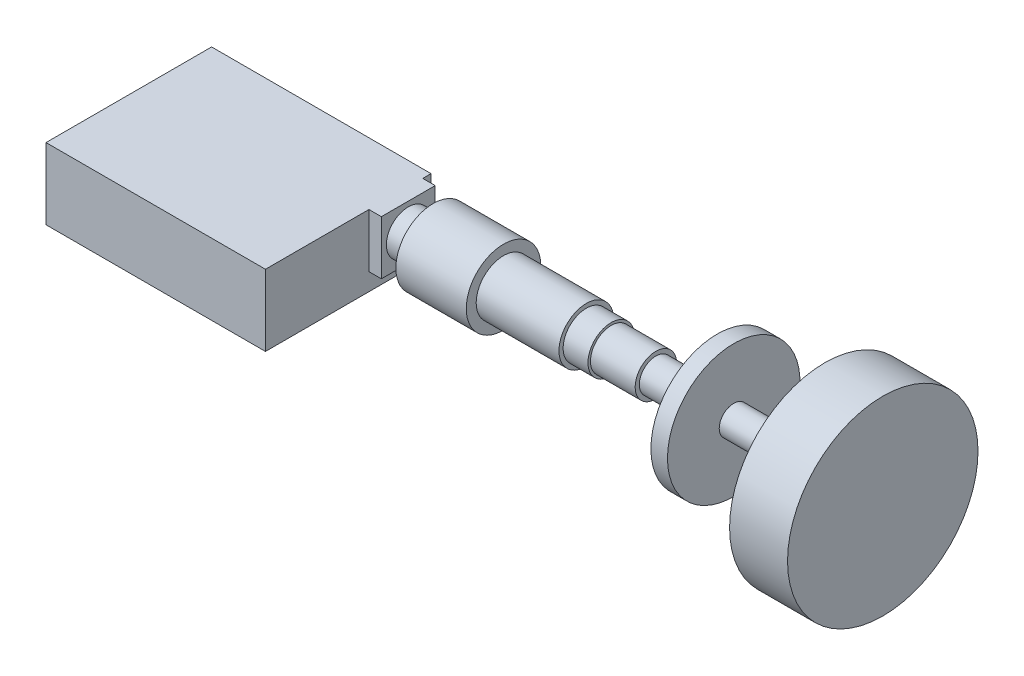
ISO-10303-21;
HEADER;
FILE_DESCRIPTION(('STEP AP214'),'2;1');
FILE_NAME('part.step','',(''),(''),'','','');
FILE_SCHEMA(('AUTOMOTIVE_DESIGN { 1 0 10303 214 1 1 1 1 }'));
ENDSEC;
DATA;
#1=APPLICATION_CONTEXT('core data for automotive mechanical design processes');
#2=APPLICATION_PROTOCOL_DEFINITION('international standard','automotive_design',2000,#1);
#3=PRODUCT_CONTEXT('',#1,'mechanical');
#4=PRODUCT('Part','Part','',(#3));
#5=PRODUCT_RELATED_PRODUCT_CATEGORY('part','',(#4));
#6=PRODUCT_DEFINITION_FORMATION('','',#4);
#7=PRODUCT_DEFINITION_CONTEXT('part definition',#1,'design');
#8=PRODUCT_DEFINITION('design','',#6,#7);
#9=PRODUCT_DEFINITION_SHAPE('','',#8);
#10=(LENGTH_UNIT() NAMED_UNIT(*) SI_UNIT(.MILLI.,.METRE.));
#11=(NAMED_UNIT(*) PLANE_ANGLE_UNIT() SI_UNIT($,.RADIAN.));
#12=(NAMED_UNIT(*) SI_UNIT($,.STERADIAN.) SOLID_ANGLE_UNIT());
#13=UNCERTAINTY_MEASURE_WITH_UNIT(LENGTH_MEASURE(1.E-05),#10,'distance_accuracy_value','');
#14=(GEOMETRIC_REPRESENTATION_CONTEXT(3) GLOBAL_UNCERTAINTY_ASSIGNED_CONTEXT((#13)) GLOBAL_UNIT_ASSIGNED_CONTEXT((#10,
#11,#12)) REPRESENTATION_CONTEXT('',''));
#15=CARTESIAN_POINT('',(0.,0.,0.));
#16=DIRECTION('',(0.,0.,1.));
#17=DIRECTION('',(1.,0.,0.));
#18=AXIS2_PLACEMENT_3D('',#15,#16,#17);
#19=CARTESIAN_POINT('',(13.25,8.6,10.));
#20=DIRECTION('',(-1.,0.,0.));
#21=DIRECTION('',(0.,0.,1.));
#22=AXIS2_PLACEMENT_3D('',#19,#20,#21);
#23=PLANE('',#22);
#24=DIRECTION('',(0.,-1.,0.));
#25=VECTOR('',#24,1.);
#26=CARTESIAN_POINT('',(13.25,8.6,-2.5));
#27=LINE('',#26,#25);
#28=CARTESIAN_POINT('',(13.25,8.6,-2.5));
#29=VERTEX_POINT('',#28);
#30=CARTESIAN_POINT('',(13.25,2.1,-2.50000000000001));
#31=VERTEX_POINT('',#30);
#32=EDGE_CURVE('E133',#29,#31,#27,.T.);
#33=ORIENTED_EDGE('',*,*,#32,.F.);
#34=DIRECTION('',(0.,0.,-1.));
#35=VECTOR('',#34,1.);
#36=CARTESIAN_POINT('',(13.25,8.6,10.));
#37=LINE('',#36,#35);
#38=CARTESIAN_POINT('',(13.25,8.6,10.));
#39=VERTEX_POINT('',#38);
#40=EDGE_CURVE('E146',#39,#29,#37,.T.);
#41=ORIENTED_EDGE('',*,*,#40,.F.);
#42=DIRECTION('',(0.,-1.,0.));
#43=VECTOR('',#42,1.);
#44=CARTESIAN_POINT('',(13.25,8.6,10.));
#45=LINE('',#44,#43);
#46=CARTESIAN_POINT('',(13.25,0.,10.));
#47=VERTEX_POINT('',#46);
#48=EDGE_CURVE('E158',#39,#47,#45,.T.);
#49=ORIENTED_EDGE('',*,*,#48,.T.);
#50=DIRECTION('',(0.,0.,-1.));
#51=VECTOR('',#50,1.);
#52=CARTESIAN_POINT('',(13.25,0.,10.));
#53=LINE('',#52,#51);
#54=CARTESIAN_POINT('',(13.25,0.,-10.));
#55=VERTEX_POINT('',#54);
#56=EDGE_CURVE('E135',#47,#55,#53,.T.);
#57=ORIENTED_EDGE('',*,*,#56,.T.);
#58=DIRECTION('',(0.,-1.,0.));
#59=VECTOR('',#58,1.);
#60=CARTESIAN_POINT('',(13.25,8.6,-10.));
#61=LINE('',#60,#59);
#62=CARTESIAN_POINT('',(13.25,8.6,-10.));
#63=VERTEX_POINT('',#62);
#64=EDGE_CURVE('E11',#63,#55,#61,.T.);
#65=ORIENTED_EDGE('',*,*,#64,.F.);
#66=CARTESIAN_POINT('',(13.25,8.6,-9.));
#67=VERTEX_POINT('',#66);
#68=EDGE_CURVE('E66',#67,#63,#37,.T.);
#69=ORIENTED_EDGE('',*,*,#68,.F.);
#70=DIRECTION('',(0.,1.,0.));
#71=VECTOR('',#70,1.);
#72=CARTESIAN_POINT('',(13.25,8.6,-9.));
#73=LINE('',#72,#71);
#74=CARTESIAN_POINT('',(13.25,2.1,-9.));
#75=VERTEX_POINT('',#74);
#76=EDGE_CURVE('E130',#75,#67,#73,.T.);
#77=ORIENTED_EDGE('',*,*,#76,.F.);
#78=DIRECTION('',(0.,0.,-1.));
#79=VECTOR('',#78,1.);
#80=CARTESIAN_POINT('',(13.25,2.1,-2.50000000000001));
#81=LINE('',#80,#79);
#82=EDGE_CURVE('E60',#31,#75,#81,.T.);
#83=ORIENTED_EDGE('',*,*,#82,.F.);
#84=EDGE_LOOP('',(#33,#41,#49,#57,#65,#69,#77,#83));
#85=FACE_BOUND('',#84,.T.);
#86=ADVANCED_FACE('F45',(#85),#23,.F.);
#87=CARTESIAN_POINT('',(-13.25,8.6,-10.));
#88=DIRECTION('',(0.,0.,1.));
#89=DIRECTION('',(1.,0.,0.));
#90=AXIS2_PLACEMENT_3D('',#87,#88,#89);
#91=PLANE('',#90);
#92=DIRECTION('',(-1.,0.,0.));
#93=VECTOR('',#92,1.);
#94=CARTESIAN_POINT('',(-13.25,0.,-10.));
#95=LINE('',#94,#93);
#96=CARTESIAN_POINT('',(-13.25,0.,-10.));
#97=VERTEX_POINT('',#96);
#98=EDGE_CURVE('E140',#55,#97,#95,.T.);
#99=ORIENTED_EDGE('',*,*,#98,.T.);
#100=DIRECTION('',(0.,-1.,0.));
#101=VECTOR('',#100,1.);
#102=CARTESIAN_POINT('',(-13.25,8.6,-10.));
#103=LINE('',#102,#101);
#104=CARTESIAN_POINT('',(-13.25,8.6,-10.));
#105=VERTEX_POINT('',#104);
#106=EDGE_CURVE('E53',#105,#97,#103,.T.);
#107=ORIENTED_EDGE('',*,*,#106,.F.);
#108=DIRECTION('',(-1.,0.,0.));
#109=VECTOR('',#108,1.);
#110=CARTESIAN_POINT('',(-13.25,8.6,-10.));
#111=LINE('',#110,#109);
#112=EDGE_CURVE('E150',#63,#105,#111,.T.);
#113=ORIENTED_EDGE('',*,*,#112,.F.);
#114=ORIENTED_EDGE('',*,*,#64,.T.);
#115=EDGE_LOOP('',(#99,#107,#113,#114));
#116=FACE_BOUND('',#115,.T.);
#117=ADVANCED_FACE('F296',(#116),#91,.F.);
#118=CARTESIAN_POINT('',(-13.25,8.6,10.));
#119=DIRECTION('',(1.,0.,0.));
#120=DIRECTION('',(0.,0.,-1.));
#121=AXIS2_PLACEMENT_3D('',#118,#119,#120);
#122=PLANE('',#121);
#123=DIRECTION('',(0.,0.,1.));
#124=VECTOR('',#123,1.);
#125=CARTESIAN_POINT('',(-13.25,0.,10.));
#126=LINE('',#125,#124);
#127=CARTESIAN_POINT('',(-13.25,0.,10.));
#128=VERTEX_POINT('',#127);
#129=EDGE_CURVE('E162',#97,#128,#126,.T.);
#130=ORIENTED_EDGE('',*,*,#129,.T.);
#131=DIRECTION('',(0.,-1.,0.));
#132=VECTOR('',#131,1.);
#133=CARTESIAN_POINT('',(-13.25,8.6,10.));
#134=LINE('',#133,#132);
#135=CARTESIAN_POINT('',(-13.25,8.6,10.));
#136=VERTEX_POINT('',#135);
#137=EDGE_CURVE('E171',#136,#128,#134,.T.);
#138=ORIENTED_EDGE('',*,*,#137,.F.);
#139=DIRECTION('',(0.,0.,1.));
#140=VECTOR('',#139,1.);
#141=CARTESIAN_POINT('',(-13.25,8.6,10.));
#142=LINE('',#141,#140);
#143=EDGE_CURVE('E153',#105,#136,#142,.T.);
#144=ORIENTED_EDGE('',*,*,#143,.F.);
#145=ORIENTED_EDGE('',*,*,#106,.T.);
#146=EDGE_LOOP('',(#130,#138,#144,#145));
#147=FACE_BOUND('',#146,.T.);
#148=ADVANCED_FACE('F180',(#147),#122,.F.);
#149=CARTESIAN_POINT('',(-13.25,8.6,10.));
#150=DIRECTION('',(0.,0.,-1.));
#151=DIRECTION('',(-1.,0.,0.));
#152=AXIS2_PLACEMENT_3D('',#149,#150,#151);
#153=PLANE('',#152);
#154=DIRECTION('',(1.,0.,0.));
#155=VECTOR('',#154,1.);
#156=CARTESIAN_POINT('',(-13.25,0.,10.));
#157=LINE('',#156,#155);
#158=EDGE_CURVE('E165',#128,#47,#157,.T.);
#159=ORIENTED_EDGE('',*,*,#158,.T.);
#160=ORIENTED_EDGE('',*,*,#48,.F.);
#161=DIRECTION('',(1.,0.,0.));
#162=VECTOR('',#161,1.);
#163=CARTESIAN_POINT('',(-13.25,8.6,10.));
#164=LINE('',#163,#162);
#165=EDGE_CURVE('E156',#136,#39,#164,.T.);
#166=ORIENTED_EDGE('',*,*,#165,.F.);
#167=ORIENTED_EDGE('',*,*,#137,.T.);
#168=EDGE_LOOP('',(#159,#160,#166,#167));
#169=FACE_BOUND('',#168,.T.);
#170=ADVANCED_FACE('F190',(#169),#153,.F.);
#171=CARTESIAN_POINT('',(0.,8.6,0.));
#172=DIRECTION('',(0.,-1.,0.));
#173=DIRECTION('',(0.,0.,-1.));
#174=AXIS2_PLACEMENT_3D('',#171,#172,#173);
#175=PLANE('',#174);
#176=ORIENTED_EDGE('',*,*,#40,.T.);
#177=DIRECTION('',(-1.,0.,0.));
#178=VECTOR('',#177,1.);
#179=CARTESIAN_POINT('',(14.75,8.6,-2.5));
#180=LINE('',#179,#178);
#181=CARTESIAN_POINT('',(14.75,8.6,-2.5));
#182=VERTEX_POINT('',#181);
#183=EDGE_CURVE('E195',#182,#29,#180,.T.);
#184=ORIENTED_EDGE('',*,*,#183,.F.);
#185=DIRECTION('',(0.,0.,1.));
#186=VECTOR('',#185,1.);
#187=CARTESIAN_POINT('',(14.75,8.6,-2.5));
#188=LINE('',#187,#186);
#189=CARTESIAN_POINT('',(14.75,8.6,-9.));
#190=VERTEX_POINT('',#189);
#191=EDGE_CURVE('E125',#190,#182,#188,.T.);
#192=ORIENTED_EDGE('',*,*,#191,.F.);
#193=DIRECTION('',(-1.,0.,0.));
#194=VECTOR('',#193,1.);
#195=CARTESIAN_POINT('',(14.75,8.6,-9.));
#196=LINE('',#195,#194);
#197=EDGE_CURVE('E142',#190,#67,#196,.T.);
#198=ORIENTED_EDGE('',*,*,#197,.T.);
#199=ORIENTED_EDGE('',*,*,#68,.T.);
#200=ORIENTED_EDGE('',*,*,#112,.T.);
#201=ORIENTED_EDGE('',*,*,#143,.T.);
#202=ORIENTED_EDGE('',*,*,#165,.T.);
#203=EDGE_LOOP('',(#176,#184,#192,#198,#199,#200,#201,#202));
#204=FACE_BOUND('',#203,.T.);
#205=ADVANCED_FACE('F194',(#204),#175,.F.);
#206=CARTESIAN_POINT('',(0.,0.,0.));
#207=DIRECTION('',(0.,-1.,0.));
#208=DIRECTION('',(0.,0.,-1.));
#209=AXIS2_PLACEMENT_3D('',#206,#207,#208);
#210=PLANE('',#209);
#211=ORIENTED_EDGE('',*,*,#56,.F.);
#212=ORIENTED_EDGE('',*,*,#158,.F.);
#213=ORIENTED_EDGE('',*,*,#129,.F.);
#214=ORIENTED_EDGE('',*,*,#98,.F.);
#215=EDGE_LOOP('',(#211,#212,#213,#214));
#216=FACE_BOUND('',#215,.T.);
#217=ADVANCED_FACE('F187',(#216),#210,.T.);
#218=CARTESIAN_POINT('',(14.75,8.6,-2.5));
#219=DIRECTION('',(0.,0.,-1.));
#220=DIRECTION('',(0.,1.,0.));
#221=AXIS2_PLACEMENT_3D('',#218,#219,#220);
#222=PLANE('',#221);
#223=ORIENTED_EDGE('',*,*,#32,.T.);
#224=DIRECTION('',(-1.,0.,0.));
#225=VECTOR('',#224,1.);
#226=CARTESIAN_POINT('',(14.75,2.1,-2.50000000000001));
#227=LINE('',#226,#225);
#228=CARTESIAN_POINT('',(14.75,2.1,-2.50000000000001));
#229=VERTEX_POINT('',#228);
#230=EDGE_CURVE('E112',#229,#31,#227,.T.);
#231=ORIENTED_EDGE('',*,*,#230,.F.);
#232=DIRECTION('',(0.,-1.,0.));
#233=VECTOR('',#232,1.);
#234=CARTESIAN_POINT('',(14.75,8.6,-2.5));
#235=LINE('',#234,#233);
#236=EDGE_CURVE('E120',#182,#229,#235,.T.);
#237=ORIENTED_EDGE('',*,*,#236,.F.);
#238=ORIENTED_EDGE('',*,*,#183,.T.);
#239=EDGE_LOOP('',(#223,#231,#237,#238));
#240=FACE_BOUND('',#239,.T.);
#241=ADVANCED_FACE('F132',(#240),#222,.F.);
#242=CARTESIAN_POINT('',(14.75,2.1,-2.50000000000001));
#243=DIRECTION('',(0.,1.,0.));
#244=DIRECTION('',(0.,0.,1.));
#245=AXIS2_PLACEMENT_3D('',#242,#243,#244);
#246=PLANE('',#245);
#247=ORIENTED_EDGE('',*,*,#82,.T.);
#248=DIRECTION('',(-1.,0.,0.));
#249=VECTOR('',#248,1.);
#250=CARTESIAN_POINT('',(14.75,2.1,-9.));
#251=LINE('',#250,#249);
#252=CARTESIAN_POINT('',(14.75,2.1,-9.));
#253=VERTEX_POINT('',#252);
#254=EDGE_CURVE('E115',#253,#75,#251,.T.);
#255=ORIENTED_EDGE('',*,*,#254,.F.);
#256=DIRECTION('',(0.,0.,-1.));
#257=VECTOR('',#256,1.);
#258=CARTESIAN_POINT('',(14.75,2.1,-2.50000000000001));
#259=LINE('',#258,#257);
#260=EDGE_CURVE('E108',#229,#253,#259,.T.);
#261=ORIENTED_EDGE('',*,*,#260,.F.);
#262=ORIENTED_EDGE('',*,*,#230,.T.);
#263=EDGE_LOOP('',(#247,#255,#261,#262));
#264=FACE_BOUND('',#263,.T.);
#265=ADVANCED_FACE('F110',(#264),#246,.F.);
#266=CARTESIAN_POINT('',(14.75,8.6,-9.));
#267=DIRECTION('',(0.,0.,1.));
#268=DIRECTION('',(0.,-1.,0.));
#269=AXIS2_PLACEMENT_3D('',#266,#267,#268);
#270=PLANE('',#269);
#271=ORIENTED_EDGE('',*,*,#76,.T.);
#272=ORIENTED_EDGE('',*,*,#197,.F.);
#273=DIRECTION('',(0.,1.,0.));
#274=VECTOR('',#273,1.);
#275=CARTESIAN_POINT('',(14.75,8.6,-9.));
#276=LINE('',#275,#274);
#277=EDGE_CURVE('E119',#253,#190,#276,.T.);
#278=ORIENTED_EDGE('',*,*,#277,.F.);
#279=ORIENTED_EDGE('',*,*,#254,.T.);
#280=EDGE_LOOP('',(#271,#272,#278,#279));
#281=FACE_BOUND('',#280,.T.);
#282=ADVANCED_FACE('F315',(#281),#270,.F.);
#283=CARTESIAN_POINT('',(14.75,0.,0.));
#284=DIRECTION('',(1.,0.,0.));
#285=DIRECTION('',(0.,0.,-1.));
#286=AXIS2_PLACEMENT_3D('',#283,#284,#285);
#287=PLANE('',#286);
#288=CARTESIAN_POINT('',(14.75,5.35,-5.75000000000001));
#289=DIRECTION('',(-1.,0.,0.));
#290=DIRECTION('',(0.,0.,1.));
#291=AXIS2_PLACEMENT_3D('',#288,#289,#290);
#292=CIRCLE('',#291,2.65);
#293=CARTESIAN_POINT('',(14.75,5.35,-3.1));
#294=VERTEX_POINT('',#293);
#295=EDGE_CURVE('E208',#294,#294,#292,.T.);
#296=ORIENTED_EDGE('',*,*,#295,.T.);
#297=EDGE_LOOP('',(#296));
#298=FACE_BOUND('',#297,.T.);
#299=ORIENTED_EDGE('',*,*,#236,.T.);
#300=ORIENTED_EDGE('',*,*,#260,.T.);
#301=ORIENTED_EDGE('',*,*,#277,.T.);
#302=ORIENTED_EDGE('',*,*,#191,.T.);
#303=EDGE_LOOP('',(#299,#300,#301,#302));
#304=FACE_BOUND('',#303,.T.);
#305=ADVANCED_FACE('F123',(#298,#304),#287,.T.);
#306=CARTESIAN_POINT('',(14.75,5.35,-5.75000000000001));
#307=DIRECTION('',(-1.,0.,0.));
#308=DIRECTION('',(0.,0.,1.));
#309=AXIS2_PLACEMENT_3D('',#306,#307,#308);
#310=CYLINDRICAL_SURFACE('',#309,2.65);
#311=CARTESIAN_POINT('',(17.75,5.35,-5.75000000000001));
#312=DIRECTION('',(-1.,0.,0.));
#313=DIRECTION('',(0.,0.,1.));
#314=AXIS2_PLACEMENT_3D('',#311,#312,#313);
#315=CIRCLE('',#314,2.65);
#316=CARTESIAN_POINT('',(17.75,5.35,-3.1));
#317=VERTEX_POINT('',#316);
#318=EDGE_CURVE('E215',#317,#317,#315,.T.);
#319=ORIENTED_EDGE('',*,*,#318,.T.);
#320=EDGE_LOOP('',(#319));
#321=FACE_BOUND('',#320,.T.);
#322=ORIENTED_EDGE('',*,*,#295,.F.);
#323=EDGE_LOOP('',(#322));
#324=FACE_BOUND('',#323,.T.);
#325=ADVANCED_FACE('F321',(#321,#324),#310,.T.);
#326=CARTESIAN_POINT('',(17.75,2.7,-5.75000000000001));
#327=DIRECTION('',(-1.,0.,0.));
#328=DIRECTION('',(0.,0.,1.));
#329=AXIS2_PLACEMENT_3D('',#326,#327,#328);
#330=PLANE('',#329);
#331=CARTESIAN_POINT('',(17.75,5.35,-5.75000000000001));
#332=DIRECTION('',(-1.,0.,0.));
#333=DIRECTION('',(0.,0.,1.));
#334=AXIS2_PLACEMENT_3D('',#331,#332,#333);
#335=CIRCLE('',#334,4.5);
#336=CARTESIAN_POINT('',(17.75,5.35,-1.25000000000001));
#337=VERTEX_POINT('',#336);
#338=EDGE_CURVE('E219',#337,#337,#335,.T.);
#339=ORIENTED_EDGE('',*,*,#338,.T.);
#340=EDGE_LOOP('',(#339));
#341=FACE_BOUND('',#340,.T.);
#342=ORIENTED_EDGE('',*,*,#318,.F.);
#343=EDGE_LOOP('',(#342));
#344=FACE_BOUND('',#343,.T.);
#345=ADVANCED_FACE('F325',(#341,#344),#330,.T.);
#346=CARTESIAN_POINT('',(14.75,5.35,-5.75000000000001));
#347=DIRECTION('',(-1.,0.,0.));
#348=DIRECTION('',(0.,0.,1.));
#349=AXIS2_PLACEMENT_3D('',#346,#347,#348);
#350=CYLINDRICAL_SURFACE('',#349,4.5);
#351=CARTESIAN_POINT('',(26.25,5.35,-5.75000000000001));
#352=DIRECTION('',(-1.,0.,0.));
#353=DIRECTION('',(0.,0.,1.));
#354=AXIS2_PLACEMENT_3D('',#351,#352,#353);
#355=CIRCLE('',#354,4.5);
#356=CARTESIAN_POINT('',(26.25,5.35,-1.25000000000001));
#357=VERTEX_POINT('',#356);
#358=EDGE_CURVE('E223',#357,#357,#355,.T.);
#359=ORIENTED_EDGE('',*,*,#358,.T.);
#360=EDGE_LOOP('',(#359));
#361=FACE_BOUND('',#360,.T.);
#362=ORIENTED_EDGE('',*,*,#338,.F.);
#363=EDGE_LOOP('',(#362));
#364=FACE_BOUND('',#363,.T.);
#365=ADVANCED_FACE('F329',(#361,#364),#350,.T.);
#366=CARTESIAN_POINT('',(26.25,0.850000000000002,-5.75000000000001));
#367=DIRECTION('',(1.,0.,0.));
#368=DIRECTION('',(0.,0.,-1.));
#369=AXIS2_PLACEMENT_3D('',#366,#367,#368);
#370=PLANE('',#369);
#371=CARTESIAN_POINT('',(26.25,5.35,-5.75000000000001));
#372=DIRECTION('',(-1.,0.,0.));
#373=DIRECTION('',(0.,0.,1.));
#374=AXIS2_PLACEMENT_3D('',#371,#372,#373);
#375=CIRCLE('',#374,3.3);
#376=CARTESIAN_POINT('',(26.25,5.35,-2.45000000000001));
#377=VERTEX_POINT('',#376);
#378=EDGE_CURVE('E227',#377,#377,#375,.T.);
#379=ORIENTED_EDGE('',*,*,#378,.T.);
#380=EDGE_LOOP('',(#379));
#381=FACE_BOUND('',#380,.T.);
#382=ORIENTED_EDGE('',*,*,#358,.F.);
#383=EDGE_LOOP('',(#382));
#384=FACE_BOUND('',#383,.T.);
#385=ADVANCED_FACE('F333',(#381,#384),#370,.T.);
#386=CARTESIAN_POINT('',(14.75,5.35,-5.75000000000001));
#387=DIRECTION('',(-1.,0.,0.));
#388=DIRECTION('',(0.,0.,1.));
#389=AXIS2_PLACEMENT_3D('',#386,#387,#388);
#390=CYLINDRICAL_SURFACE('',#389,3.3);
#391=CARTESIAN_POINT('',(36.25,5.35,-5.75000000000001));
#392=DIRECTION('',(-1.,0.,0.));
#393=DIRECTION('',(0.,0.,1.));
#394=AXIS2_PLACEMENT_3D('',#391,#392,#393);
#395=CIRCLE('',#394,3.3);
#396=CARTESIAN_POINT('',(36.25,5.35,-2.45000000000001));
#397=VERTEX_POINT('',#396);
#398=EDGE_CURVE('E231',#397,#397,#395,.T.);
#399=ORIENTED_EDGE('',*,*,#398,.T.);
#400=EDGE_LOOP('',(#399));
#401=FACE_BOUND('',#400,.T.);
#402=ORIENTED_EDGE('',*,*,#378,.F.);
#403=EDGE_LOOP('',(#402));
#404=FACE_BOUND('',#403,.T.);
#405=ADVANCED_FACE('F337',(#401,#404),#390,.T.);
#406=CARTESIAN_POINT('',(36.25,2.05,-5.75000000000001));
#407=DIRECTION('',(1.,0.,0.));
#408=DIRECTION('',(0.,0.,-1.));
#409=AXIS2_PLACEMENT_3D('',#406,#407,#408);
#410=PLANE('',#409);
#411=CARTESIAN_POINT('',(36.25,5.35,-5.75000000000001));
#412=DIRECTION('',(-1.,0.,0.));
#413=DIRECTION('',(0.,0.,1.));
#414=AXIS2_PLACEMENT_3D('',#411,#412,#413);
#415=CIRCLE('',#414,2.8);
#416=CARTESIAN_POINT('',(36.25,5.35,-2.95000000000001));
#417=VERTEX_POINT('',#416);
#418=EDGE_CURVE('E235',#417,#417,#415,.T.);
#419=ORIENTED_EDGE('',*,*,#418,.T.);
#420=EDGE_LOOP('',(#419));
#421=FACE_BOUND('',#420,.T.);
#422=ORIENTED_EDGE('',*,*,#398,.F.);
#423=EDGE_LOOP('',(#422));
#424=FACE_BOUND('',#423,.T.);
#425=ADVANCED_FACE('F341',(#421,#424),#410,.T.);
#426=CARTESIAN_POINT('',(14.75,5.35,-5.75000000000001));
#427=DIRECTION('',(-1.,0.,0.));
#428=DIRECTION('',(0.,0.,1.));
#429=AXIS2_PLACEMENT_3D('',#426,#427,#428);
#430=CYLINDRICAL_SURFACE('',#429,2.8);
#431=CARTESIAN_POINT('',(39.25,5.35,-5.75000000000001));
#432=DIRECTION('',(-1.,0.,0.));
#433=DIRECTION('',(0.,0.,1.));
#434=AXIS2_PLACEMENT_3D('',#431,#432,#433);
#435=CIRCLE('',#434,2.8);
#436=CARTESIAN_POINT('',(39.25,5.35,-2.95000000000001));
#437=VERTEX_POINT('',#436);
#438=EDGE_CURVE('E239',#437,#437,#435,.T.);
#439=ORIENTED_EDGE('',*,*,#438,.T.);
#440=EDGE_LOOP('',(#439));
#441=FACE_BOUND('',#440,.T.);
#442=ORIENTED_EDGE('',*,*,#418,.F.);
#443=EDGE_LOOP('',(#442));
#444=FACE_BOUND('',#443,.T.);
#445=ADVANCED_FACE('F345',(#441,#444),#430,.T.);
#446=CARTESIAN_POINT('',(39.25,2.55,-5.75000000000001));
#447=DIRECTION('',(1.,0.,0.));
#448=DIRECTION('',(0.,0.,-1.));
#449=AXIS2_PLACEMENT_3D('',#446,#447,#448);
#450=PLANE('',#449);
#451=CARTESIAN_POINT('',(39.25,5.35,-5.75000000000001));
#452=DIRECTION('',(-1.,0.,0.));
#453=DIRECTION('',(0.,0.,1.));
#454=AXIS2_PLACEMENT_3D('',#451,#452,#453);
#455=CIRCLE('',#454,2.5);
#456=CARTESIAN_POINT('',(39.25,5.35,-3.25000000000001));
#457=VERTEX_POINT('',#456);
#458=EDGE_CURVE('E243',#457,#457,#455,.T.);
#459=ORIENTED_EDGE('',*,*,#458,.T.);
#460=EDGE_LOOP('',(#459));
#461=FACE_BOUND('',#460,.T.);
#462=ORIENTED_EDGE('',*,*,#438,.F.);
#463=EDGE_LOOP('',(#462));
#464=FACE_BOUND('',#463,.T.);
#465=ADVANCED_FACE('F349',(#461,#464),#450,.T.);
#466=CARTESIAN_POINT('',(14.75,5.35,-5.75000000000001));
#467=DIRECTION('',(-1.,0.,0.));
#468=DIRECTION('',(0.,0.,1.));
#469=AXIS2_PLACEMENT_3D('',#466,#467,#468);
#470=CYLINDRICAL_SURFACE('',#469,2.5);
#471=CARTESIAN_POINT('',(44.65,5.35,-5.75000000000001));
#472=DIRECTION('',(-1.,0.,0.));
#473=DIRECTION('',(0.,0.,1.));
#474=AXIS2_PLACEMENT_3D('',#471,#472,#473);
#475=CIRCLE('',#474,2.5);
#476=CARTESIAN_POINT('',(44.65,5.35,-3.25000000000001));
#477=VERTEX_POINT('',#476);
#478=EDGE_CURVE('E247',#477,#477,#475,.T.);
#479=ORIENTED_EDGE('',*,*,#478,.T.);
#480=EDGE_LOOP('',(#479));
#481=FACE_BOUND('',#480,.T.);
#482=ORIENTED_EDGE('',*,*,#458,.F.);
#483=EDGE_LOOP('',(#482));
#484=FACE_BOUND('',#483,.T.);
#485=ADVANCED_FACE('F353',(#481,#484),#470,.T.);
#486=CARTESIAN_POINT('',(44.65,2.85,-5.75000000000001));
#487=DIRECTION('',(1.,0.,0.));
#488=DIRECTION('',(0.,0.,-1.));
#489=AXIS2_PLACEMENT_3D('',#486,#487,#488);
#490=PLANE('',#489);
#491=CARTESIAN_POINT('',(44.65,5.35,-5.75000000000001));
#492=DIRECTION('',(-1.,0.,0.));
#493=DIRECTION('',(0.,0.,1.));
#494=AXIS2_PLACEMENT_3D('',#491,#492,#493);
#495=CIRCLE('',#494,2.);
#496=CARTESIAN_POINT('',(44.65,5.35,-3.75000000000001));
#497=VERTEX_POINT('',#496);
#498=EDGE_CURVE('E251',#497,#497,#495,.T.);
#499=ORIENTED_EDGE('',*,*,#498,.T.);
#500=EDGE_LOOP('',(#499));
#501=FACE_BOUND('',#500,.T.);
#502=ORIENTED_EDGE('',*,*,#478,.F.);
#503=EDGE_LOOP('',(#502));
#504=FACE_BOUND('',#503,.T.);
#505=ADVANCED_FACE('F357',(#501,#504),#490,.T.);
#506=CARTESIAN_POINT('',(14.75,5.35,-5.75000000000001));
#507=DIRECTION('',(-1.,0.,0.));
#508=DIRECTION('',(0.,0.,1.));
#509=AXIS2_PLACEMENT_3D('',#506,#507,#508);
#510=CYLINDRICAL_SURFACE('',#509,2.);
#511=CARTESIAN_POINT('',(52.05,5.35,-5.75000000000001));
#512=DIRECTION('',(-1.,0.,0.));
#513=DIRECTION('',(0.,0.,1.));
#514=AXIS2_PLACEMENT_3D('',#511,#512,#513);
#515=CIRCLE('',#514,2.);
#516=CARTESIAN_POINT('',(52.05,5.35,-3.75000000000001));
#517=VERTEX_POINT('',#516);
#518=EDGE_CURVE('E255',#517,#517,#515,.T.);
#519=ORIENTED_EDGE('',*,*,#518,.T.);
#520=EDGE_LOOP('',(#519));
#521=FACE_BOUND('',#520,.T.);
#522=ORIENTED_EDGE('',*,*,#498,.F.);
#523=EDGE_LOOP('',(#522));
#524=FACE_BOUND('',#523,.T.);
#525=ADVANCED_FACE('F361',(#521,#524),#510,.T.);
#526=CARTESIAN_POINT('',(52.05,3.35,-5.75000000000001));
#527=DIRECTION('',(-1.,0.,0.));
#528=DIRECTION('',(0.,0.,1.));
#529=AXIS2_PLACEMENT_3D('',#526,#527,#528);
#530=PLANE('',#529);
#531=CARTESIAN_POINT('',(52.05,5.35,-5.75000000000001));
#532=DIRECTION('',(-1.,0.,0.));
#533=DIRECTION('',(0.,0.,1.));
#534=AXIS2_PLACEMENT_3D('',#531,#532,#533);
#535=CIRCLE('',#534,7.99999999999999);
#536=CARTESIAN_POINT('',(52.05,5.35,2.24999999999999));
#537=VERTEX_POINT('',#536);
#538=EDGE_CURVE('E259',#537,#537,#535,.T.);
#539=ORIENTED_EDGE('',*,*,#538,.T.);
#540=EDGE_LOOP('',(#539));
#541=FACE_BOUND('',#540,.T.);
#542=ORIENTED_EDGE('',*,*,#518,.F.);
#543=EDGE_LOOP('',(#542));
#544=FACE_BOUND('',#543,.T.);
#545=ADVANCED_FACE('F365',(#541,#544),#530,.T.);
#546=CARTESIAN_POINT('',(14.75,5.35,-5.75000000000001));
#547=DIRECTION('',(-1.,0.,0.));
#548=DIRECTION('',(0.,0.,1.));
#549=AXIS2_PLACEMENT_3D('',#546,#547,#548);
#550=CYLINDRICAL_SURFACE('',#549,7.99999999999999);
#551=CARTESIAN_POINT('',(54.05,5.35,-5.75000000000001));
#552=DIRECTION('',(-1.,0.,0.));
#553=DIRECTION('',(0.,0.,1.));
#554=AXIS2_PLACEMENT_3D('',#551,#552,#553);
#555=CIRCLE('',#554,7.99999999999999);
#556=CARTESIAN_POINT('',(54.05,5.35,2.24999999999999));
#557=VERTEX_POINT('',#556);
#558=EDGE_CURVE('E263',#557,#557,#555,.T.);
#559=ORIENTED_EDGE('',*,*,#558,.T.);
#560=EDGE_LOOP('',(#559));
#561=FACE_BOUND('',#560,.T.);
#562=ORIENTED_EDGE('',*,*,#538,.F.);
#563=EDGE_LOOP('',(#562));
#564=FACE_BOUND('',#563,.T.);
#565=ADVANCED_FACE('F369',(#561,#564),#550,.T.);
#566=CARTESIAN_POINT('',(54.05,-2.65,-5.75000000000001));
#567=DIRECTION('',(1.,0.,0.));
#568=DIRECTION('',(0.,0.,-1.));
#569=AXIS2_PLACEMENT_3D('',#566,#567,#568);
#570=PLANE('',#569);
#571=CARTESIAN_POINT('',(54.05,5.35,-5.75000000000001));
#572=DIRECTION('',(-1.,0.,0.));
#573=DIRECTION('',(0.,0.,1.));
#574=AXIS2_PLACEMENT_3D('',#571,#572,#573);
#575=CIRCLE('',#574,1.75);
#576=CARTESIAN_POINT('',(54.05,5.35,-4.00000000000001));
#577=VERTEX_POINT('',#576);
#578=EDGE_CURVE('E267',#577,#577,#575,.T.);
#579=ORIENTED_EDGE('',*,*,#578,.T.);
#580=EDGE_LOOP('',(#579));
#581=FACE_BOUND('',#580,.T.);
#582=ORIENTED_EDGE('',*,*,#558,.F.);
#583=EDGE_LOOP('',(#582));
#584=FACE_BOUND('',#583,.T.);
#585=ADVANCED_FACE('F373',(#581,#584),#570,.T.);
#586=CARTESIAN_POINT('',(14.75,5.35,-5.75000000000001));
#587=DIRECTION('',(-1.,0.,0.));
#588=DIRECTION('',(0.,0.,1.));
#589=AXIS2_PLACEMENT_3D('',#586,#587,#588);
#590=CYLINDRICAL_SURFACE('',#589,1.74999999999999);
#591=CARTESIAN_POINT('',(65.05,5.35,-5.75000000000001));
#592=DIRECTION('',(-1.,0.,0.));
#593=DIRECTION('',(0.,0.,1.));
#594=AXIS2_PLACEMENT_3D('',#591,#592,#593);
#595=CIRCLE('',#594,1.74999999999999);
#596=CARTESIAN_POINT('',(65.05,5.35,-4.00000000000001));
#597=VERTEX_POINT('',#596);
#598=EDGE_CURVE('E271',#597,#597,#595,.T.);
#599=ORIENTED_EDGE('',*,*,#598,.T.);
#600=EDGE_LOOP('',(#599));
#601=FACE_BOUND('',#600,.T.);
#602=ORIENTED_EDGE('',*,*,#578,.F.);
#603=EDGE_LOOP('',(#602));
#604=FACE_BOUND('',#603,.T.);
#605=ADVANCED_FACE('F377',(#601,#604),#590,.T.);
#606=CARTESIAN_POINT('',(65.05,3.60000000000001,-5.75000000000001));
#607=DIRECTION('',(-1.,0.,0.));
#608=DIRECTION('',(0.,0.,1.));
#609=AXIS2_PLACEMENT_3D('',#606,#607,#608);
#610=PLANE('',#609);
#611=CARTESIAN_POINT('',(65.05,5.35,-5.75000000000001));
#612=DIRECTION('',(-1.,0.,0.));
#613=DIRECTION('',(0.,0.,1.));
#614=AXIS2_PLACEMENT_3D('',#611,#612,#613);
#615=CIRCLE('',#614,11.5);
#616=CARTESIAN_POINT('',(65.05,5.35,5.74999999999999));
#617=VERTEX_POINT('',#616);
#618=EDGE_CURVE('E275',#617,#617,#615,.T.);
#619=ORIENTED_EDGE('',*,*,#618,.T.);
#620=EDGE_LOOP('',(#619));
#621=FACE_BOUND('',#620,.T.);
#622=ORIENTED_EDGE('',*,*,#598,.F.);
#623=EDGE_LOOP('',(#622));
#624=FACE_BOUND('',#623,.T.);
#625=ADVANCED_FACE('F293',(#621,#624),#610,.T.);
#626=CARTESIAN_POINT('',(14.75,5.35,-5.75000000000001));
#627=DIRECTION('',(-1.,0.,0.));
#628=DIRECTION('',(0.,0.,1.));
#629=AXIS2_PLACEMENT_3D('',#626,#627,#628);
#630=CYLINDRICAL_SURFACE('',#629,11.5);
#631=CARTESIAN_POINT('',(72.05,5.35,-5.75000000000001));
#632=DIRECTION('',(-1.,0.,0.));
#633=DIRECTION('',(0.,0.,1.));
#634=AXIS2_PLACEMENT_3D('',#631,#632,#633);
#635=CIRCLE('',#634,11.5);
#636=CARTESIAN_POINT('',(72.05,5.35,5.74999999999999));
#637=VERTEX_POINT('',#636);
#638=EDGE_CURVE('E279',#637,#637,#635,.T.);
#639=ORIENTED_EDGE('',*,*,#638,.T.);
#640=EDGE_LOOP('',(#639));
#641=FACE_BOUND('',#640,.T.);
#642=ORIENTED_EDGE('',*,*,#618,.F.);
#643=EDGE_LOOP('',(#642));
#644=FACE_BOUND('',#643,.T.);
#645=ADVANCED_FACE('F284',(#641,#644),#630,.T.);
#646=CARTESIAN_POINT('',(72.05,-6.15,-5.75000000000001));
#647=DIRECTION('',(1.,0.,0.));
#648=DIRECTION('',(0.,0.,-1.));
#649=AXIS2_PLACEMENT_3D('',#646,#647,#648);
#650=PLANE('',#649);
#651=ORIENTED_EDGE('',*,*,#638,.F.);
#652=EDGE_LOOP('',(#651));
#653=FACE_BOUND('',#652,.T.);
#654=ADVANCED_FACE('F287',(#653),#650,.T.);
#655=CLOSED_SHELL('',(#86,#117,#148,#170,#205,#217,#241,#265,#282,#305,#325,#345,#365,#385,#405,
#425,#445,#465,#485,#505,#525,#545,#565,#585,#605,#625,#645,#654));
#656=MANIFOLD_SOLID_BREP('B2',#655);
#657=ADVANCED_BREP_SHAPE_REPRESENTATION('',(#18,#656),#14);
#658=SHAPE_DEFINITION_REPRESENTATION(#9,#657);
ENDSEC;
END-ISO-10303-21;
